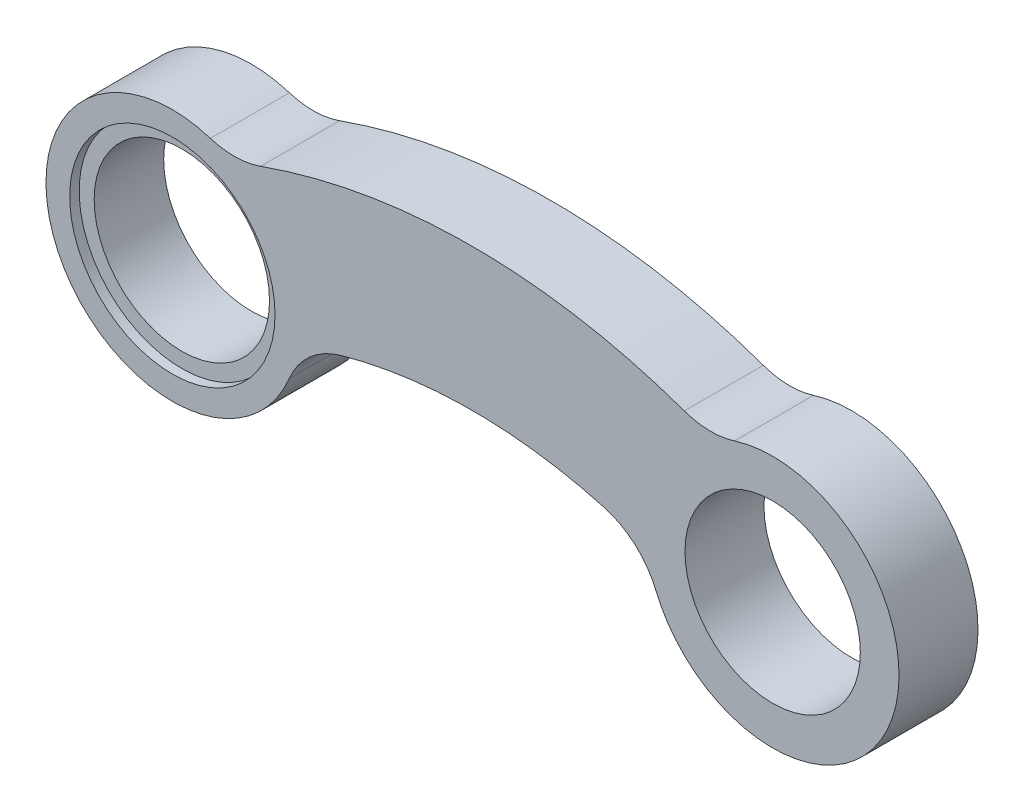
ISO-10303-21;
HEADER;
FILE_DESCRIPTION(('STEP AP214'),'2;1');
FILE_NAME('part.step','',(''),(''),'','','');
FILE_SCHEMA(('AUTOMOTIVE_DESIGN { 1 0 10303 214 1 1 1 1 }'));
ENDSEC;
DATA;
#1=APPLICATION_CONTEXT('core data for automotive mechanical design processes');
#2=APPLICATION_PROTOCOL_DEFINITION('international standard','automotive_design',2000,#1);
#3=PRODUCT_CONTEXT('',#1,'mechanical');
#4=PRODUCT('Part','Part','',(#3));
#5=PRODUCT_RELATED_PRODUCT_CATEGORY('part','',(#4));
#6=PRODUCT_DEFINITION_FORMATION('','',#4);
#7=PRODUCT_DEFINITION_CONTEXT('part definition',#1,'design');
#8=PRODUCT_DEFINITION('design','',#6,#7);
#9=PRODUCT_DEFINITION_SHAPE('','',#8);
#10=(LENGTH_UNIT() NAMED_UNIT(*) SI_UNIT(.MILLI.,.METRE.));
#11=(NAMED_UNIT(*) PLANE_ANGLE_UNIT() SI_UNIT($,.RADIAN.));
#12=(NAMED_UNIT(*) SI_UNIT($,.STERADIAN.) SOLID_ANGLE_UNIT());
#13=UNCERTAINTY_MEASURE_WITH_UNIT(LENGTH_MEASURE(1.E-05),#10,'distance_accuracy_value','');
#14=(GEOMETRIC_REPRESENTATION_CONTEXT(3) GLOBAL_UNCERTAINTY_ASSIGNED_CONTEXT((#13)) GLOBAL_UNIT_ASSIGNED_CONTEXT((#10,
#11,#12)) REPRESENTATION_CONTEXT('',''));
#15=CARTESIAN_POINT('',(0.,0.,0.));
#16=DIRECTION('',(0.,0.,1.));
#17=DIRECTION('',(1.,0.,0.));
#18=AXIS2_PLACEMENT_3D('',#15,#16,#17);
#19=CARTESIAN_POINT('',(-38.,0.,15.6977705423414));
#20=DIRECTION('',(0.,0.,-1.));
#21=DIRECTION('',(-1.,0.,0.));
#22=AXIS2_PLACEMENT_3D('',#19,#20,#21);
#23=CYLINDRICAL_SURFACE('',#22,5.55);
#24=CARTESIAN_POINT('',(-38.,0.,-5.));
#25=DIRECTION('',(0.,0.,-1.));
#26=DIRECTION('',(-1.,0.,0.));
#27=AXIS2_PLACEMENT_3D('',#24,#25,#26);
#28=CIRCLE('',#27,5.55);
#29=CARTESIAN_POINT('',(-43.55,0.,-5.));
#30=VERTEX_POINT('',#29);
#31=EDGE_CURVE('E189',#30,#30,#28,.T.);
#32=ORIENTED_EDGE('',*,*,#31,.T.);
#33=EDGE_LOOP('',(#32));
#34=FACE_BOUND('',#33,.T.);
#35=CARTESIAN_POINT('',(-38.,0.,-0.6));
#36=DIRECTION('',(0.,0.,1.));
#37=DIRECTION('',(1.,0.,0.));
#38=AXIS2_PLACEMENT_3D('',#35,#36,#37);
#39=CIRCLE('',#38,5.55);
#40=CARTESIAN_POINT('',(-32.45,0.,-0.6));
#41=VERTEX_POINT('',#40);
#42=EDGE_CURVE('E43',#41,#41,#39,.F.);
#43=ORIENTED_EDGE('',*,*,#42,.F.);
#44=EDGE_LOOP('',(#43));
#45=FACE_BOUND('',#44,.T.);
#46=ADVANCED_FACE('F39',(#34,#45),#23,.F.);
#47=CARTESIAN_POINT('',(-19.,-30.,-5.));
#48=DIRECTION('',(0.,0.,1.));
#49=DIRECTION('',(1.,0.,0.));
#50=AXIS2_PLACEMENT_3D('',#47,#48,#49);
#51=CYLINDRICAL_SURFACE('',#50,31.);
#52=CARTESIAN_POINT('',(-19.,-30.,-5.));
#53=DIRECTION('',(0.,0.,-1.));
#54=DIRECTION('',(1.,0.,0.));
#55=AXIS2_PLACEMENT_3D('',#52,#53,#54);
#56=CIRCLE('',#55,31.);
#57=CARTESIAN_POINT('',(-27.3238190227261,-0.138418714393185,-5.));
#58=VERTEX_POINT('',#57);
#59=CARTESIAN_POINT('',(-10.6761809772739,-0.138418714393181,-5.));
#60=VERTEX_POINT('',#59);
#61=EDGE_CURVE('E169',#58,#60,#56,.T.);
#62=ORIENTED_EDGE('',*,*,#61,.T.);
#63=DIRECTION('',(0.,0.,1.));
#64=VECTOR('',#63,1.);
#65=CARTESIAN_POINT('',(-10.6761809772739,-0.138418714393181,-5.));
#66=LINE('',#65,#64);
#67=CARTESIAN_POINT('',(-10.6761809772739,-0.138418714393181,0.));
#68=VERTEX_POINT('',#67);
#69=EDGE_CURVE('E149',#60,#68,#66,.T.);
#70=ORIENTED_EDGE('',*,*,#69,.T.);
#71=CARTESIAN_POINT('',(-19.,-30.,0.));
#72=DIRECTION('',(0.,0.,-1.));
#73=DIRECTION('',(1.,0.,0.));
#74=AXIS2_PLACEMENT_3D('',#71,#72,#73);
#75=CIRCLE('',#74,31.);
#76=CARTESIAN_POINT('',(-27.3238190227261,-0.138418714393185,0.));
#77=VERTEX_POINT('',#76);
#78=EDGE_CURVE('E111',#77,#68,#75,.T.);
#79=ORIENTED_EDGE('',*,*,#78,.F.);
#80=DIRECTION('',(0.,0.,1.));
#81=VECTOR('',#80,1.);
#82=CARTESIAN_POINT('',(-27.3238190227261,-0.138418714393181,-5.));
#83=LINE('',#82,#81);
#84=EDGE_CURVE('E62',#77,#58,#83,.F.);
#85=ORIENTED_EDGE('',*,*,#84,.T.);
#86=EDGE_LOOP('',(#62,#70,#79,#85));
#87=FACE_BOUND('',#86,.T.);
#88=ADVANCED_FACE('F162',(#87),#51,.F.);
#89=CARTESIAN_POINT('',(-38.,0.,-5.));
#90=DIRECTION('',(0.,0.,1.));
#91=DIRECTION('',(1.,0.,0.));
#92=AXIS2_PLACEMENT_3D('',#89,#90,#91);
#93=CYLINDRICAL_SURFACE('',#92,8.);
#94=CARTESIAN_POINT('',(-38.,0.,0.));
#95=DIRECTION('',(0.,0.,1.));
#96=DIRECTION('',(1.,0.,0.));
#97=AXIS2_PLACEMENT_3D('',#94,#95,#96);
#98=CIRCLE('',#97,8.);
#99=CARTESIAN_POINT('',(-35.5905645502675,7.62853988739471,0.));
#100=VERTEX_POINT('',#99);
#101=CARTESIAN_POINT('',(-30.6038569645832,-3.04910941090269,0.));
#102=VERTEX_POINT('',#101);
#103=EDGE_CURVE('E136',#100,#102,#98,.T.);
#104=ORIENTED_EDGE('',*,*,#103,.F.);
#105=DIRECTION('',(0.,0.,1.));
#106=VECTOR('',#105,1.);
#107=CARTESIAN_POINT('',(-35.5905645502675,7.62853988739471,-5.));
#108=LINE('',#107,#106);
#109=CARTESIAN_POINT('',(-35.5905645502675,7.62853988739471,-5.));
#110=VERTEX_POINT('',#109);
#111=EDGE_CURVE('E146',#100,#110,#108,.F.);
#112=ORIENTED_EDGE('',*,*,#111,.T.);
#113=CARTESIAN_POINT('',(-38.,0.,-5.));
#114=DIRECTION('',(0.,0.,1.));
#115=DIRECTION('',(1.,0.,0.));
#116=AXIS2_PLACEMENT_3D('',#113,#114,#115);
#117=CIRCLE('',#116,8.);
#118=CARTESIAN_POINT('',(-30.6038569645832,-3.04910941090269,-5.));
#119=VERTEX_POINT('',#118);
#120=EDGE_CURVE('E128',#110,#119,#117,.T.);
#121=ORIENTED_EDGE('',*,*,#120,.T.);
#122=DIRECTION('',(0.,0.,1.));
#123=VECTOR('',#122,1.);
#124=CARTESIAN_POINT('',(-30.6038569645832,-3.04910941090269,-5.));
#125=LINE('',#124,#123);
#126=EDGE_CURVE('E143',#119,#102,#125,.T.);
#127=ORIENTED_EDGE('',*,*,#126,.T.);
#128=EDGE_LOOP('',(#104,#112,#121,#127));
#129=FACE_BOUND('',#128,.T.);
#130=ADVANCED_FACE('F171',(#129),#93,.T.);
#131=CARTESIAN_POINT('',(-19.,-30.,-5.));
#132=DIRECTION('',(0.,0.,1.));
#133=DIRECTION('',(1.,0.,0.));
#134=AXIS2_PLACEMENT_3D('',#131,#132,#133);
#135=CYLINDRICAL_SURFACE('',#134,40.);
#136=CARTESIAN_POINT('',(-19.,-30.,0.));
#137=DIRECTION('',(0.,0.,1.));
#138=DIRECTION('',(1.,0.,0.));
#139=AXIS2_PLACEMENT_3D('',#136,#137,#138);
#140=CIRCLE('',#139,40.);
#141=CARTESIAN_POINT('',(-5.59140676072479,7.6856687262368,0.));
#142=VERTEX_POINT('',#141);
#143=CARTESIAN_POINT('',(-32.4085932392752,7.68566872623681,0.));
#144=VERTEX_POINT('',#143);
#145=EDGE_CURVE('E125',#142,#144,#140,.T.);
#146=ORIENTED_EDGE('',*,*,#145,.F.);
#147=DIRECTION('',(0.,0.,1.));
#148=VECTOR('',#147,1.);
#149=CARTESIAN_POINT('',(-5.59140676072478,7.68566872623681,-5.));
#150=LINE('',#149,#148);
#151=CARTESIAN_POINT('',(-5.59140676072479,7.6856687262368,-5.));
#152=VERTEX_POINT('',#151);
#153=EDGE_CURVE('E141',#142,#152,#150,.F.);
#154=ORIENTED_EDGE('',*,*,#153,.T.);
#155=CARTESIAN_POINT('',(-19.,-30.,-5.));
#156=DIRECTION('',(0.,0.,1.));
#157=DIRECTION('',(1.,0.,0.));
#158=AXIS2_PLACEMENT_3D('',#155,#156,#157);
#159=CIRCLE('',#158,40.);
#160=CARTESIAN_POINT('',(-32.4085932392752,7.68566872623681,-5.));
#161=VERTEX_POINT('',#160);
#162=EDGE_CURVE('E133',#152,#161,#159,.T.);
#163=ORIENTED_EDGE('',*,*,#162,.T.);
#164=DIRECTION('',(0.,0.,1.));
#165=VECTOR('',#164,1.);
#166=CARTESIAN_POINT('',(-32.4085932392752,7.6856687262368,-5.));
#167=LINE('',#166,#165);
#168=EDGE_CURVE('E130',#161,#144,#167,.T.);
#169=ORIENTED_EDGE('',*,*,#168,.T.);
#170=EDGE_LOOP('',(#146,#154,#163,#169));
#171=FACE_BOUND('',#170,.T.);
#172=ADVANCED_FACE('F181',(#171),#135,.T.);
#173=CARTESIAN_POINT('',(0.,0.,-5.));
#174=DIRECTION('',(0.,0.,1.));
#175=DIRECTION('',(1.,0.,0.));
#176=AXIS2_PLACEMENT_3D('',#173,#174,#175);
#177=CYLINDRICAL_SURFACE('',#176,8.);
#178=CARTESIAN_POINT('',(0.,0.,-5.));
#179=DIRECTION('',(0.,0.,1.));
#180=DIRECTION('',(1.,0.,0.));
#181=AXIS2_PLACEMENT_3D('',#178,#179,#180);
#182=CIRCLE('',#181,8.);
#183=CARTESIAN_POINT('',(-7.39614303541681,-3.04910941090268,-5.));
#184=VERTEX_POINT('',#183);
#185=CARTESIAN_POINT('',(-2.40943544973255,7.62853988739471,-5.));
#186=VERTEX_POINT('',#185);
#187=EDGE_CURVE('E184',#184,#186,#182,.T.);
#188=ORIENTED_EDGE('',*,*,#187,.T.);
#189=DIRECTION('',(0.,0.,1.));
#190=VECTOR('',#189,1.);
#191=CARTESIAN_POINT('',(-2.40943544973255,7.62853988739471,-5.));
#192=LINE('',#191,#190);
#193=CARTESIAN_POINT('',(-2.40943544973255,7.62853988739471,0.));
#194=VERTEX_POINT('',#193);
#195=EDGE_CURVE('E124',#186,#194,#192,.T.);
#196=ORIENTED_EDGE('',*,*,#195,.T.);
#197=CARTESIAN_POINT('',(0.,0.,0.));
#198=DIRECTION('',(0.,0.,1.));
#199=DIRECTION('',(1.,0.,0.));
#200=AXIS2_PLACEMENT_3D('',#197,#198,#199);
#201=CIRCLE('',#200,8.);
#202=CARTESIAN_POINT('',(-7.39614303541681,-3.04910941090268,0.));
#203=VERTEX_POINT('',#202);
#204=EDGE_CURVE('E110',#203,#194,#201,.T.);
#205=ORIENTED_EDGE('',*,*,#204,.F.);
#206=DIRECTION('',(0.,0.,1.));
#207=VECTOR('',#206,1.);
#208=CARTESIAN_POINT('',(-7.39614303541681,-3.04910941090268,-5.));
#209=LINE('',#208,#207);
#210=EDGE_CURVE('E122',#203,#184,#209,.F.);
#211=ORIENTED_EDGE('',*,*,#210,.T.);
#212=EDGE_LOOP('',(#188,#196,#205,#211));
#213=FACE_BOUND('',#212,.T.);
#214=ADVANCED_FACE('F121',(#213),#177,.T.);
#215=CARTESIAN_POINT('',(-28.5,-15.,-5.));
#216=DIRECTION('',(0.,0.,1.));
#217=DIRECTION('',(1.,0.,0.));
#218=AXIS2_PLACEMENT_3D('',#215,#216,#217);
#219=PLANE('',#218);
#220=CARTESIAN_POINT('',(0.,0.,-5.));
#221=DIRECTION('',(0.,0.,-1.));
#222=DIRECTION('',(-1.,0.,0.));
#223=AXIS2_PLACEMENT_3D('',#220,#221,#222);
#224=CIRCLE('',#223,5.55);
#225=CARTESIAN_POINT('',(-5.55,0.,-5.));
#226=VERTEX_POINT('',#225);
#227=EDGE_CURVE('E192',#226,#226,#224,.T.);
#228=ORIENTED_EDGE('',*,*,#227,.F.);
#229=EDGE_LOOP('',(#228));
#230=FACE_BOUND('',#229,.T.);
#231=ORIENTED_EDGE('',*,*,#31,.F.);
#232=EDGE_LOOP('',(#231));
#233=FACE_BOUND('',#232,.T.);
#234=ORIENTED_EDGE('',*,*,#61,.F.);
#235=CARTESIAN_POINT('',(-25.9812675674477,-4.95480279271686,-5.));
#236=DIRECTION('',(0.,0.,1.));
#237=DIRECTION('',(1.,0.,0.));
#238=AXIS2_PLACEMENT_3D('',#235,#236,#237);
#239=CIRCLE('',#238,5.);
#240=EDGE_CURVE('E11',#58,#119,#239,.T.);
#241=ORIENTED_EDGE('',*,*,#240,.T.);
#242=ORIENTED_EDGE('',*,*,#120,.F.);
#243=CARTESIAN_POINT('',(-34.0846673941846,12.3963773170164,-5.));
#244=DIRECTION('',(0.,0.,1.));
#245=DIRECTION('',(1.,0.,0.));
#246=AXIS2_PLACEMENT_3D('',#243,#244,#245);
#247=CIRCLE('',#246,5.);
#248=EDGE_CURVE('E116',#110,#161,#247,.T.);
#249=ORIENTED_EDGE('',*,*,#248,.T.);
#250=ORIENTED_EDGE('',*,*,#162,.F.);
#251=CARTESIAN_POINT('',(-3.91533260581539,12.3963773170164,-5.));
#252=DIRECTION('',(0.,0.,1.));
#253=DIRECTION('',(1.,0.,0.));
#254=AXIS2_PLACEMENT_3D('',#251,#252,#253);
#255=CIRCLE('',#254,5.);
#256=EDGE_CURVE('E153',#152,#186,#255,.T.);
#257=ORIENTED_EDGE('',*,*,#256,.T.);
#258=ORIENTED_EDGE('',*,*,#187,.F.);
#259=CARTESIAN_POINT('',(-12.0187324325523,-4.95480279271686,-5.));
#260=DIRECTION('',(0.,0.,1.));
#261=DIRECTION('',(1.,0.,0.));
#262=AXIS2_PLACEMENT_3D('',#259,#260,#261);
#263=CIRCLE('',#262,5.);
#264=EDGE_CURVE('E55',#184,#60,#263,.T.);
#265=ORIENTED_EDGE('',*,*,#264,.T.);
#266=EDGE_LOOP('',(#234,#241,#242,#249,#250,#257,#258,#265));
#267=FACE_BOUND('',#266,.T.);
#268=ADVANCED_FACE('F167',(#230,#233,#267),#219,.F.);
#269=CARTESIAN_POINT('',(-28.5,-15.,0.));
#270=DIRECTION('',(0.,0.,1.));
#271=DIRECTION('',(1.,0.,0.));
#272=AXIS2_PLACEMENT_3D('',#269,#270,#271);
#273=PLANE('',#272);
#274=CARTESIAN_POINT('',(-38.,0.,0.));
#275=DIRECTION('',(0.,0.,1.));
#276=DIRECTION('',(1.,0.,0.));
#277=AXIS2_PLACEMENT_3D('',#274,#275,#276);
#278=CIRCLE('',#277,6.5);
#279=CARTESIAN_POINT('',(-31.5,0.,0.));
#280=VERTEX_POINT('',#279);
#281=EDGE_CURVE('E197',#280,#280,#278,.T.);
#282=ORIENTED_EDGE('',*,*,#281,.F.);
#283=EDGE_LOOP('',(#282));
#284=FACE_BOUND('',#283,.T.);
#285=CARTESIAN_POINT('',(0.,0.,0.));
#286=DIRECTION('',(0.,0.,1.));
#287=DIRECTION('',(1.,0.,0.));
#288=AXIS2_PLACEMENT_3D('',#285,#286,#287);
#289=CIRCLE('',#288,5.55);
#290=CARTESIAN_POINT('',(5.55,0.,0.));
#291=VERTEX_POINT('',#290);
#292=EDGE_CURVE('E163',#291,#291,#289,.F.);
#293=ORIENTED_EDGE('',*,*,#292,.T.);
#294=EDGE_LOOP('',(#293));
#295=FACE_BOUND('',#294,.T.);
#296=ORIENTED_EDGE('',*,*,#103,.T.);
#297=CARTESIAN_POINT('',(-25.9812675674477,-4.95480279271686,0.));
#298=DIRECTION('',(0.,0.,1.));
#299=DIRECTION('',(1.,0.,0.));
#300=AXIS2_PLACEMENT_3D('',#297,#298,#299);
#301=CIRCLE('',#300,5.);
#302=EDGE_CURVE('E48',#102,#77,#301,.F.);
#303=ORIENTED_EDGE('',*,*,#302,.T.);
#304=ORIENTED_EDGE('',*,*,#78,.T.);
#305=CARTESIAN_POINT('',(-12.0187324325523,-4.95480279271686,0.));
#306=DIRECTION('',(0.,0.,1.));
#307=DIRECTION('',(1.,0.,0.));
#308=AXIS2_PLACEMENT_3D('',#305,#306,#307);
#309=CIRCLE('',#308,5.);
#310=EDGE_CURVE('E106',#68,#203,#309,.F.);
#311=ORIENTED_EDGE('',*,*,#310,.T.);
#312=ORIENTED_EDGE('',*,*,#204,.T.);
#313=CARTESIAN_POINT('',(-3.91533260581539,12.3963773170164,0.));
#314=DIRECTION('',(0.,0.,1.));
#315=DIRECTION('',(1.,0.,0.));
#316=AXIS2_PLACEMENT_3D('',#313,#314,#315);
#317=CIRCLE('',#316,5.);
#318=EDGE_CURVE('E151',#194,#142,#317,.F.);
#319=ORIENTED_EDGE('',*,*,#318,.T.);
#320=ORIENTED_EDGE('',*,*,#145,.T.);
#321=CARTESIAN_POINT('',(-34.0846673941846,12.3963773170164,0.));
#322=DIRECTION('',(0.,0.,1.));
#323=DIRECTION('',(1.,0.,0.));
#324=AXIS2_PLACEMENT_3D('',#321,#322,#323);
#325=CIRCLE('',#324,5.);
#326=EDGE_CURVE('E155',#144,#100,#325,.F.);
#327=ORIENTED_EDGE('',*,*,#326,.T.);
#328=EDGE_LOOP('',(#296,#303,#304,#311,#312,#319,#320,#327));
#329=FACE_BOUND('',#328,.T.);
#330=ADVANCED_FACE('F109',(#284,#295,#329),#273,.T.);
#331=CARTESIAN_POINT('',(0.,0.,15.6977705423414));
#332=DIRECTION('',(0.,0.,-1.));
#333=DIRECTION('',(-1.,0.,0.));
#334=AXIS2_PLACEMENT_3D('',#331,#332,#333);
#335=CYLINDRICAL_SURFACE('',#334,5.55);
#336=ORIENTED_EDGE('',*,*,#227,.T.);
#337=EDGE_LOOP('',(#336));
#338=FACE_BOUND('',#337,.T.);
#339=ORIENTED_EDGE('',*,*,#292,.F.);
#340=EDGE_LOOP('',(#339));
#341=FACE_BOUND('',#340,.T.);
#342=ADVANCED_FACE('F220',(#338,#341),#335,.F.);
#343=CARTESIAN_POINT('',(-3.91533260581539,12.3963773170164,-5.));
#344=DIRECTION('',(0.,0.,-1.));
#345=DIRECTION('',(-1.,0.,0.));
#346=AXIS2_PLACEMENT_3D('',#343,#344,#345);
#347=CYLINDRICAL_SURFACE('',#346,5.);
#348=ORIENTED_EDGE('',*,*,#256,.F.);
#349=ORIENTED_EDGE('',*,*,#153,.F.);
#350=ORIENTED_EDGE('',*,*,#318,.F.);
#351=ORIENTED_EDGE('',*,*,#195,.F.);
#352=EDGE_LOOP('',(#348,#349,#350,#351));
#353=FACE_BOUND('',#352,.T.);
#354=ADVANCED_FACE('F233',(#353),#347,.F.);
#355=CARTESIAN_POINT('',(-34.0846673941846,12.3963773170164,-5.));
#356=DIRECTION('',(0.,0.,-1.));
#357=DIRECTION('',(-1.,0.,0.));
#358=AXIS2_PLACEMENT_3D('',#355,#356,#357);
#359=CYLINDRICAL_SURFACE('',#358,5.);
#360=ORIENTED_EDGE('',*,*,#248,.F.);
#361=ORIENTED_EDGE('',*,*,#111,.F.);
#362=ORIENTED_EDGE('',*,*,#326,.F.);
#363=ORIENTED_EDGE('',*,*,#168,.F.);
#364=EDGE_LOOP('',(#360,#361,#362,#363));
#365=FACE_BOUND('',#364,.T.);
#366=ADVANCED_FACE('F174',(#365),#359,.F.);
#367=CARTESIAN_POINT('',(-12.0187324325523,-4.95480279271686,-5.));
#368=DIRECTION('',(0.,0.,1.));
#369=DIRECTION('',(1.,0.,0.));
#370=AXIS2_PLACEMENT_3D('',#367,#368,#369);
#371=CYLINDRICAL_SURFACE('',#370,5.);
#372=ORIENTED_EDGE('',*,*,#264,.F.);
#373=ORIENTED_EDGE('',*,*,#210,.F.);
#374=ORIENTED_EDGE('',*,*,#310,.F.);
#375=ORIENTED_EDGE('',*,*,#69,.F.);
#376=EDGE_LOOP('',(#372,#373,#374,#375));
#377=FACE_BOUND('',#376,.T.);
#378=ADVANCED_FACE('F127',(#377),#371,.F.);
#379=CARTESIAN_POINT('',(-25.9812675674477,-4.95480279271686,-5.));
#380=DIRECTION('',(0.,0.,1.));
#381=DIRECTION('',(1.,0.,0.));
#382=AXIS2_PLACEMENT_3D('',#379,#380,#381);
#383=CYLINDRICAL_SURFACE('',#382,5.);
#384=ORIENTED_EDGE('',*,*,#240,.F.);
#385=ORIENTED_EDGE('',*,*,#84,.F.);
#386=ORIENTED_EDGE('',*,*,#302,.F.);
#387=ORIENTED_EDGE('',*,*,#126,.F.);
#388=EDGE_LOOP('',(#384,#385,#386,#387));
#389=FACE_BOUND('',#388,.T.);
#390=ADVANCED_FACE('F41',(#389),#383,.F.);
#391=CARTESIAN_POINT('',(-38.,0.,-0.6));
#392=DIRECTION('',(0.,0.,1.));
#393=DIRECTION('',(1.,0.,0.));
#394=AXIS2_PLACEMENT_3D('',#391,#392,#393);
#395=PLANE('',#394);
#396=CARTESIAN_POINT('',(-38.,0.,-0.6));
#397=DIRECTION('',(0.,0.,1.));
#398=DIRECTION('',(1.,0.,0.));
#399=AXIS2_PLACEMENT_3D('',#396,#397,#398);
#400=CIRCLE('',#399,6.5);
#401=CARTESIAN_POINT('',(-31.5,0.,-0.6));
#402=VERTEX_POINT('',#401);
#403=EDGE_CURVE('E200',#402,#402,#400,.T.);
#404=ORIENTED_EDGE('',*,*,#403,.T.);
#405=EDGE_LOOP('',(#404));
#406=FACE_BOUND('',#405,.T.);
#407=ORIENTED_EDGE('',*,*,#42,.T.);
#408=EDGE_LOOP('',(#407));
#409=FACE_BOUND('',#408,.T.);
#410=ADVANCED_FACE('F207',(#406,#409),#395,.T.);
#411=CARTESIAN_POINT('',(-38.,0.,-0.6));
#412=DIRECTION('',(0.,0.,1.));
#413=DIRECTION('',(1.,0.,0.));
#414=AXIS2_PLACEMENT_3D('',#411,#412,#413);
#415=CYLINDRICAL_SURFACE('',#414,6.5);
#416=ORIENTED_EDGE('',*,*,#403,.F.);
#417=EDGE_LOOP('',(#416));
#418=FACE_BOUND('',#417,.T.);
#419=ORIENTED_EDGE('',*,*,#281,.T.);
#420=EDGE_LOOP('',(#419));
#421=FACE_BOUND('',#420,.T.);
#422=ADVANCED_FACE('F245',(#418,#421),#415,.F.);
#423=CLOSED_SHELL('',(#46,#88,#130,#172,#214,#268,#330,#342,#354,#366,#378,#390,#410,#422));
#424=MANIFOLD_SOLID_BREP('B2',#423);
#425=ADVANCED_BREP_SHAPE_REPRESENTATION('',(#18,#424),#14);
#426=SHAPE_DEFINITION_REPRESENTATION(#9,#425);
ENDSEC;
END-ISO-10303-21;
